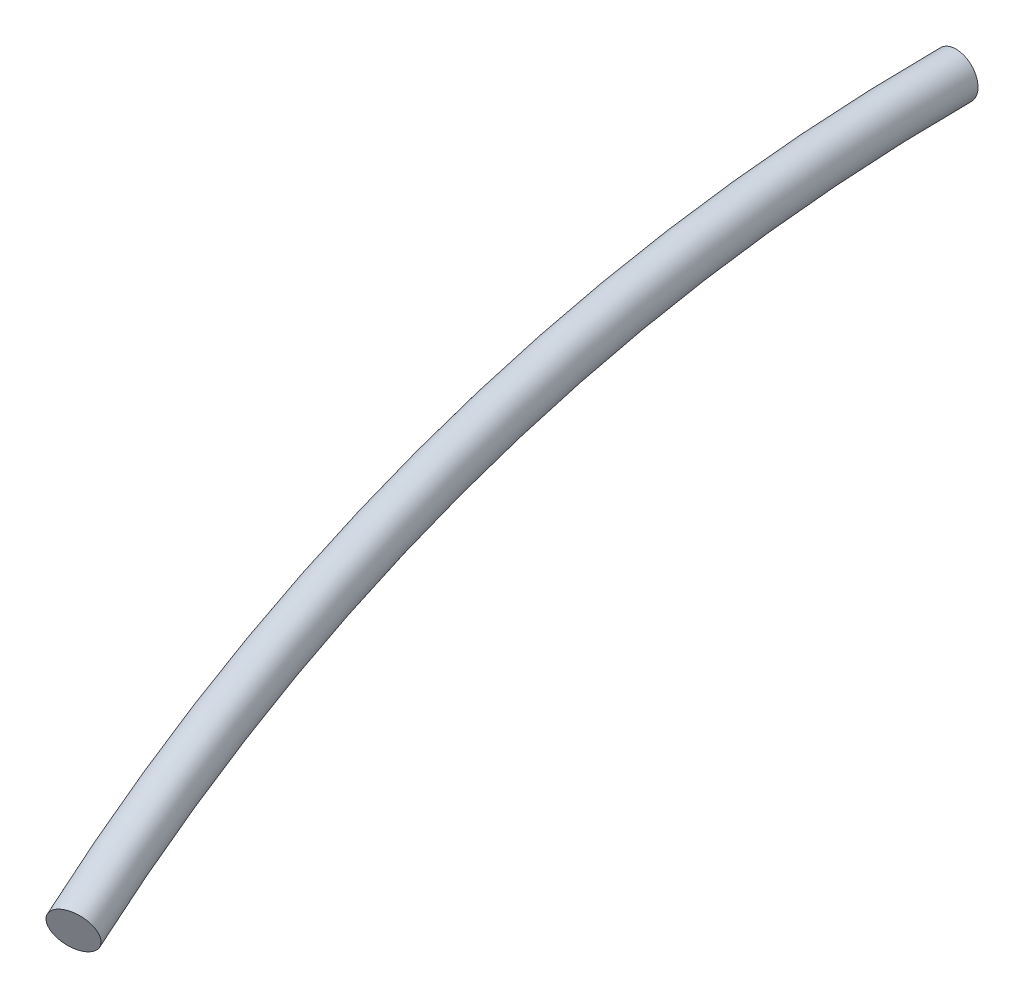
ISO-10303-21;
HEADER;
FILE_DESCRIPTION(('STEP AP214'),'2;1');
FILE_NAME('part.step','',(''),(''),'','','');
FILE_SCHEMA(('AUTOMOTIVE_DESIGN { 1 0 10303 214 1 1 1 1 }'));
ENDSEC;
DATA;
#1=APPLICATION_CONTEXT('core data for automotive mechanical design processes');
#2=APPLICATION_PROTOCOL_DEFINITION('international standard','automotive_design',2000,#1);
#3=PRODUCT_CONTEXT('',#1,'mechanical');
#4=PRODUCT('Part','Part','',(#3));
#5=PRODUCT_RELATED_PRODUCT_CATEGORY('part','',(#4));
#6=PRODUCT_DEFINITION_FORMATION('','',#4);
#7=PRODUCT_DEFINITION_CONTEXT('part definition',#1,'design');
#8=PRODUCT_DEFINITION('design','',#6,#7);
#9=PRODUCT_DEFINITION_SHAPE('','',#8);
#10=(LENGTH_UNIT() NAMED_UNIT(*) SI_UNIT(.MILLI.,.METRE.));
#11=(NAMED_UNIT(*) PLANE_ANGLE_UNIT() SI_UNIT($,.RADIAN.));
#12=(NAMED_UNIT(*) SI_UNIT($,.STERADIAN.) SOLID_ANGLE_UNIT());
#13=UNCERTAINTY_MEASURE_WITH_UNIT(LENGTH_MEASURE(1.E-05),#10,'distance_accuracy_value','');
#14=(GEOMETRIC_REPRESENTATION_CONTEXT(3) GLOBAL_UNCERTAINTY_ASSIGNED_CONTEXT((#13)) GLOBAL_UNIT_ASSIGNED_CONTEXT((#10,
#11,#12)) REPRESENTATION_CONTEXT('',''));
#15=CARTESIAN_POINT('',(0.,0.,0.));
#16=DIRECTION('',(0.,0.,1.));
#17=DIRECTION('',(1.,0.,0.));
#18=AXIS2_PLACEMENT_3D('',#15,#16,#17);
#19=CARTESIAN_POINT('',(-2188.26841029115,-19308.463469718,2.44249065417534E-11));
#20=DIRECTION('',(-0.743877870537491,-0.668315579441784,0.));
#21=DIRECTION('',(0.668315579441784,-0.743877870537491,0.));
#22=AXIS2_PLACEMENT_3D('',#19,#20,#21);
#23=TOROIDAL_SURFACE('',#22,5961.66364296442,50.7999999999827);
#24=CARTESIAN_POINT('',(-5843.89305210886,-15239.5200578181,2370.97899204844));
#25=DIRECTION('',(0.265791948994833,-0.295843393609693,0.917513665460645));
#26=DIRECTION('',(0.963157832237143,0.0410076828140229,-0.265791948994833));
#27=AXIS2_PLACEMENT_3D('',#24,#25,#26);
#28=CIRCLE('',#27,50.7999999999827);
#29=CARTESIAN_POINT('',(-5875.04303689934,-15204.8481377462,2391.1823681544));
#30=VERTEX_POINT('',#29);
#31=EDGE_CURVE('E10',#30,#30,#28,.T.);
#32=CARTESIAN_POINT('',(-6172.54110227593,-14873.7138141289,0.));
#33=DIRECTION('',(0.,0.,1.));
#34=DIRECTION('',(1.,0.,0.));
#35=AXIS2_PLACEMENT_3D('',#32,#33,#34);
#36=CIRCLE('',#35,50.7999999999827);
#37=CARTESIAN_POINT('',(-6206.49153371156,-14835.9248183056,-2.08127349449666E-13));
#38=VERTEX_POINT('',#37);
#39=EDGE_CURVE('E39',#38,#38,#36,.T.);
#40=CARTESIAN_POINT('',(-2188.26841029115,-19308.463469718,2.44249065417534E-11));
#41=DIRECTION('',(-0.743877870537491,-0.668315579441784,0.));
#42=DIRECTION('',(0.668315579441784,-0.743877870537491,0.));
#43=AXIS2_PLACEMENT_3D('',#40,#41,#42);
#44=CIRCLE('',#43,6012.4636429644);
#45=EDGE_CURVE('',#30,#38,#44,.T.);
#46=ORIENTED_EDGE('',*,*,#31,.F.);
#47=ORIENTED_EDGE('',*,*,#39,.T.);
#48=ORIENTED_EDGE('',*,*,#45,.T.);
#49=ORIENTED_EDGE('',*,*,#45,.F.);
#50=EDGE_LOOP('',(#46,#48,#47,#49));
#51=FACE_BOUND('',#50,.T.);
#52=ADVANCED_FACE('F33',(#51),#23,.T.);
#53=CARTESIAN_POINT('',(-5843.89305210886,-15239.5200578181,2370.97899204844));
#54=DIRECTION('',(0.265791948994833,-0.295843393609693,0.917513665460645));
#55=DIRECTION('',(0.963157832237143,0.0410076828140229,-0.265791948994833));
#56=AXIS2_PLACEMENT_3D('',#53,#54,#55);
#57=PLANE('',#56);
#58=ORIENTED_EDGE('',*,*,#31,.T.);
#59=EDGE_LOOP('',(#58));
#60=FACE_BOUND('',#59,.T.);
#61=ADVANCED_FACE('F48',(#60),#57,.T.);
#62=CARTESIAN_POINT('',(-6172.54110227593,-14873.7138141289,0.));
#63=DIRECTION('',(0.,0.,1.));
#64=DIRECTION('',(1.,0.,0.));
#65=AXIS2_PLACEMENT_3D('',#62,#63,#64);
#66=PLANE('',#65);
#67=ORIENTED_EDGE('',*,*,#39,.F.);
#68=EDGE_LOOP('',(#67));
#69=FACE_BOUND('',#68,.T.);
#70=ADVANCED_FACE('F46',(#69),#66,.F.);
#71=CLOSED_SHELL('',(#52,#61,#70));
#72=MANIFOLD_SOLID_BREP('B2',#71);
#73=ADVANCED_BREP_SHAPE_REPRESENTATION('',(#18,#72),#14);
#74=SHAPE_DEFINITION_REPRESENTATION(#9,#73);
ENDSEC;
END-ISO-10303-21;
